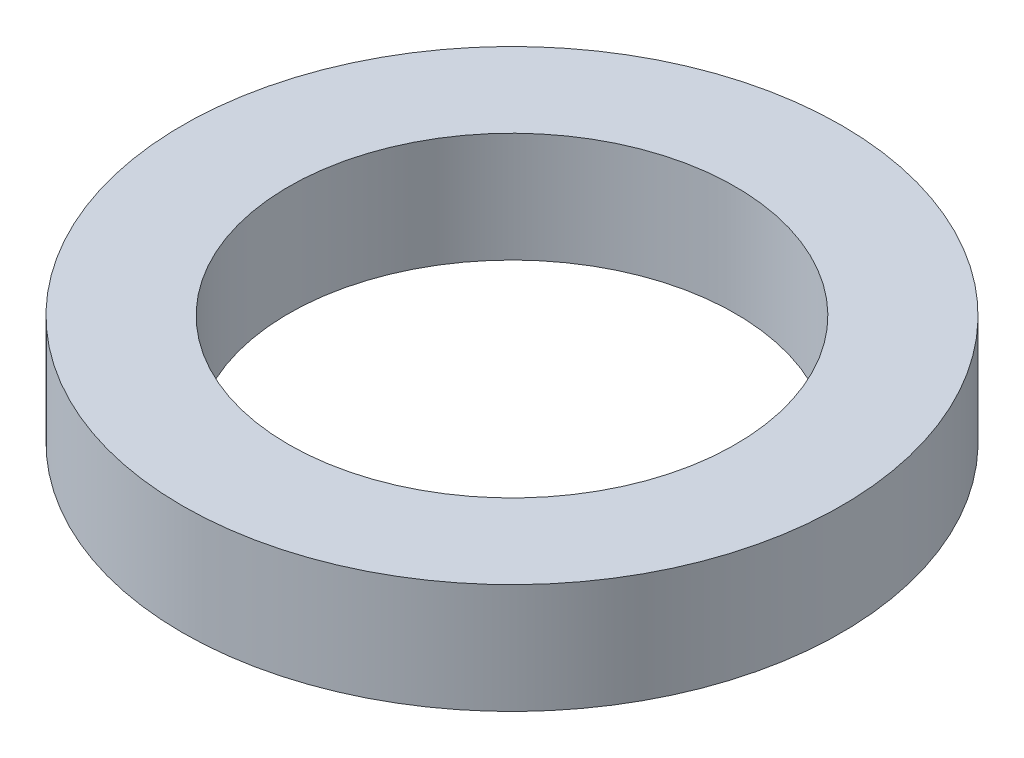
ISO-10303-21;
HEADER;
FILE_DESCRIPTION(('STEP AP214'),'2;1');
FILE_NAME('part.step','',(''),(''),'','','');
FILE_SCHEMA(('AUTOMOTIVE_DESIGN { 1 0 10303 214 1 1 1 1 }'));
ENDSEC;
DATA;
#1=APPLICATION_CONTEXT('core data for automotive mechanical design processes');
#2=APPLICATION_PROTOCOL_DEFINITION('international standard','automotive_design',2000,#1);
#3=PRODUCT_CONTEXT('',#1,'mechanical');
#4=PRODUCT('Part','Part','',(#3));
#5=PRODUCT_RELATED_PRODUCT_CATEGORY('part','',(#4));
#6=PRODUCT_DEFINITION_FORMATION('','',#4);
#7=PRODUCT_DEFINITION_CONTEXT('part definition',#1,'design');
#8=PRODUCT_DEFINITION('design','',#6,#7);
#9=PRODUCT_DEFINITION_SHAPE('','',#8);
#10=(LENGTH_UNIT() NAMED_UNIT(*) SI_UNIT(.MILLI.,.METRE.));
#11=(NAMED_UNIT(*) PLANE_ANGLE_UNIT() SI_UNIT($,.RADIAN.));
#12=(NAMED_UNIT(*) SI_UNIT($,.STERADIAN.) SOLID_ANGLE_UNIT());
#13=UNCERTAINTY_MEASURE_WITH_UNIT(LENGTH_MEASURE(1.E-05),#10,'distance_accuracy_value','');
#14=(GEOMETRIC_REPRESENTATION_CONTEXT(3) GLOBAL_UNCERTAINTY_ASSIGNED_CONTEXT((#13)) GLOBAL_UNIT_ASSIGNED_CONTEXT((#10,
#11,#12)) REPRESENTATION_CONTEXT('',''));
#15=CARTESIAN_POINT('',(0.,0.,0.));
#16=DIRECTION('',(0.,0.,1.));
#17=DIRECTION('',(1.,0.,0.));
#18=AXIS2_PLACEMENT_3D('',#15,#16,#17);
#19=CARTESIAN_POINT('',(-19.0091828831705,-215.,-53.2448828787845));
#20=DIRECTION('',(0.,-1.,0.));
#21=DIRECTION('',(0.,0.,-1.));
#22=AXIS2_PLACEMENT_3D('',#19,#20,#21);
#23=CYLINDRICAL_SURFACE('',#22,9.);
#24=CARTESIAN_POINT('',(-19.0091828831705,-215.,-53.2448828787845));
#25=DIRECTION('',(0.,1.,0.));
#26=DIRECTION('',(0.,0.,1.));
#27=AXIS2_PLACEMENT_3D('',#24,#25,#26);
#28=CIRCLE('',#27,9.);
#29=CARTESIAN_POINT('',(-19.0091828831705,-215.,-44.2448828787845));
#30=VERTEX_POINT('',#29);
#31=EDGE_CURVE('E10',#30,#30,#28,.T.);
#32=ORIENTED_EDGE('',*,*,#31,.F.);
#33=EDGE_LOOP('',(#32));
#34=FACE_BOUND('',#33,.T.);
#35=CARTESIAN_POINT('',(-19.0091828831705,-218.,-53.2448828787845));
#36=DIRECTION('',(0.,1.,0.));
#37=DIRECTION('',(0.,0.,1.));
#38=AXIS2_PLACEMENT_3D('',#35,#36,#37);
#39=CIRCLE('',#38,9.);
#40=CARTESIAN_POINT('',(-19.0091828831705,-218.,-44.2448828787845));
#41=VERTEX_POINT('',#40);
#42=EDGE_CURVE('E46',#41,#41,#39,.T.);
#43=ORIENTED_EDGE('',*,*,#42,.T.);
#44=EDGE_LOOP('',(#43));
#45=FACE_BOUND('',#44,.T.);
#46=ADVANCED_FACE('F39',(#34,#45),#23,.T.);
#47=CARTESIAN_POINT('',(-19.0091828831705,-215.,-53.2448828787845));
#48=DIRECTION('',(0.,1.,0.));
#49=DIRECTION('',(0.,0.,1.));
#50=AXIS2_PLACEMENT_3D('',#47,#48,#49);
#51=PLANE('',#50);
#52=CARTESIAN_POINT('',(-19.0091828831705,-215.,-53.2448828787845));
#53=DIRECTION('',(0.,1.,0.));
#54=DIRECTION('',(0.,0.,1.));
#55=AXIS2_PLACEMENT_3D('',#52,#53,#54);
#56=CIRCLE('',#55,6.1);
#57=CARTESIAN_POINT('',(-19.0091828831705,-215.,-47.1448828787845));
#58=VERTEX_POINT('',#57);
#59=EDGE_CURVE('E51',#58,#58,#56,.F.);
#60=ORIENTED_EDGE('',*,*,#59,.T.);
#61=EDGE_LOOP('',(#60));
#62=FACE_BOUND('',#61,.T.);
#63=ORIENTED_EDGE('',*,*,#31,.T.);
#64=EDGE_LOOP('',(#63));
#65=FACE_BOUND('',#64,.T.);
#66=ADVANCED_FACE('F63',(#62,#65),#51,.T.);
#67=CARTESIAN_POINT('',(-19.0091828831705,-218.,-53.2448828787845));
#68=DIRECTION('',(0.,1.,0.));
#69=DIRECTION('',(0.,0.,1.));
#70=AXIS2_PLACEMENT_3D('',#67,#68,#69);
#71=PLANE('',#70);
#72=CARTESIAN_POINT('',(-19.0091828831705,-218.,-53.2448828787845));
#73=DIRECTION('',(0.,1.,0.));
#74=DIRECTION('',(0.,0.,1.));
#75=AXIS2_PLACEMENT_3D('',#72,#73,#74);
#76=CIRCLE('',#75,6.1);
#77=CARTESIAN_POINT('',(-19.0091828831705,-218.,-47.1448828787845));
#78=VERTEX_POINT('',#77);
#79=EDGE_CURVE('E45',#78,#78,#76,.F.);
#80=ORIENTED_EDGE('',*,*,#79,.F.);
#81=EDGE_LOOP('',(#80));
#82=FACE_BOUND('',#81,.T.);
#83=ORIENTED_EDGE('',*,*,#42,.F.);
#84=EDGE_LOOP('',(#83));
#85=FACE_BOUND('',#84,.T.);
#86=ADVANCED_FACE('F61',(#82,#85),#71,.F.);
#87=CARTESIAN_POINT('',(-19.0091828831705,-214.9,-53.2448828787845));
#88=DIRECTION('',(0.,-1.,0.));
#89=DIRECTION('',(0.,0.,-1.));
#90=AXIS2_PLACEMENT_3D('',#87,#88,#89);
#91=CYLINDRICAL_SURFACE('',#90,6.1);
#92=ORIENTED_EDGE('',*,*,#59,.F.);
#93=EDGE_LOOP('',(#92));
#94=FACE_BOUND('',#93,.T.);
#95=ORIENTED_EDGE('',*,*,#79,.T.);
#96=EDGE_LOOP('',(#95));
#97=FACE_BOUND('',#96,.T.);
#98=ADVANCED_FACE('F56',(#94,#97),#91,.F.);
#99=CLOSED_SHELL('',(#46,#66,#86,#98));
#100=MANIFOLD_SOLID_BREP('B2',#99);
#101=ADVANCED_BREP_SHAPE_REPRESENTATION('',(#18,#100),#14);
#102=SHAPE_DEFINITION_REPRESENTATION(#9,#101);
ENDSEC;
END-ISO-10303-21;
